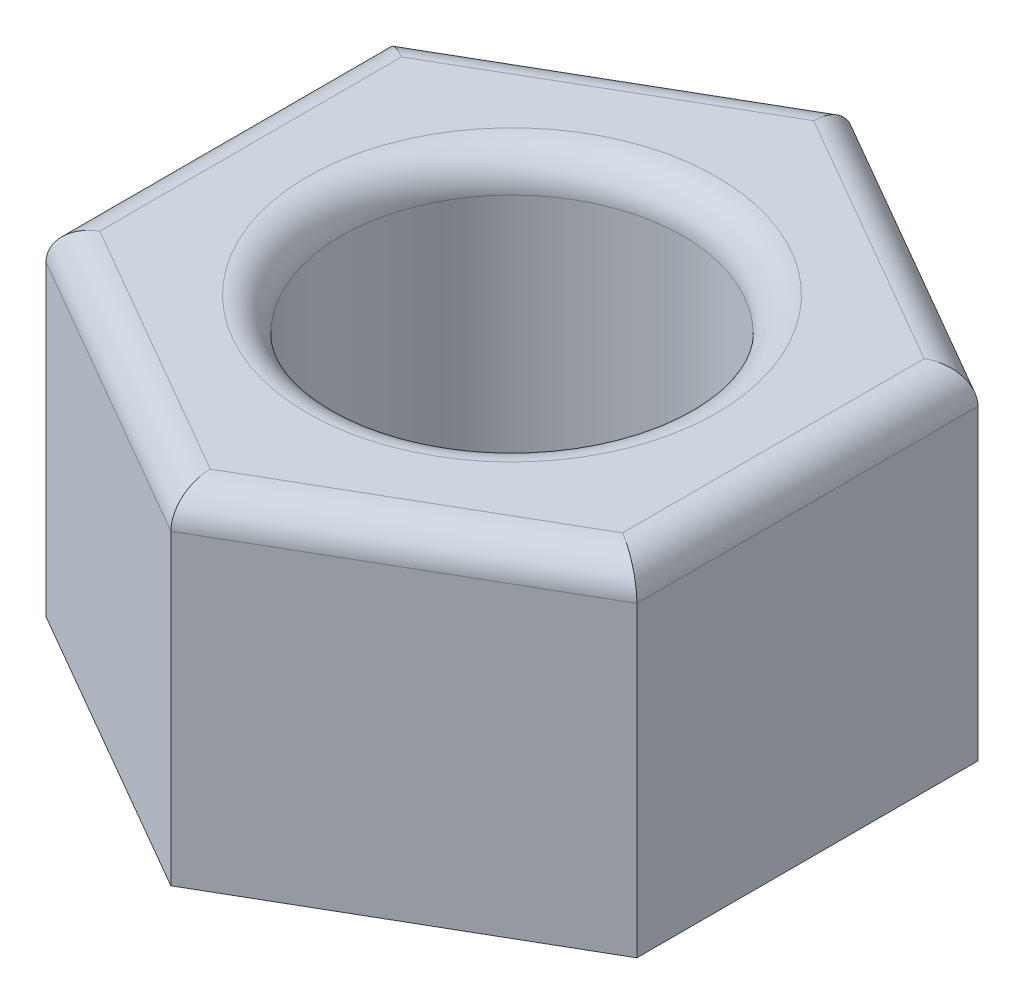
ISO-10303-21;
HEADER;
FILE_DESCRIPTION(('STEP AP214'),'2;1');
FILE_NAME('part.step','',(''),(''),'','','');
FILE_SCHEMA(('AUTOMOTIVE_DESIGN { 1 0 10303 214 1 1 1 1 }'));
ENDSEC;
DATA;
#1=APPLICATION_CONTEXT('core data for automotive mechanical design processes');
#2=APPLICATION_PROTOCOL_DEFINITION('international standard','automotive_design',2000,#1);
#3=PRODUCT_CONTEXT('',#1,'mechanical');
#4=PRODUCT('Part','Part','',(#3));
#5=PRODUCT_RELATED_PRODUCT_CATEGORY('part','',(#4));
#6=PRODUCT_DEFINITION_FORMATION('','',#4);
#7=PRODUCT_DEFINITION_CONTEXT('part definition',#1,'design');
#8=PRODUCT_DEFINITION('design','',#6,#7);
#9=PRODUCT_DEFINITION_SHAPE('','',#8);
#10=(LENGTH_UNIT() NAMED_UNIT(*) SI_UNIT(.MILLI.,.METRE.));
#11=(NAMED_UNIT(*) PLANE_ANGLE_UNIT() SI_UNIT($,.RADIAN.));
#12=(NAMED_UNIT(*) SI_UNIT($,.STERADIAN.) SOLID_ANGLE_UNIT());
#13=UNCERTAINTY_MEASURE_WITH_UNIT(LENGTH_MEASURE(1.E-05),#10,'distance_accuracy_value','');
#14=(GEOMETRIC_REPRESENTATION_CONTEXT(3) GLOBAL_UNCERTAINTY_ASSIGNED_CONTEXT((#13)) GLOBAL_UNIT_ASSIGNED_CONTEXT((#10,
#11,#12)) REPRESENTATION_CONTEXT('',''));
#15=CARTESIAN_POINT('',(0.,0.,0.));
#16=DIRECTION('',(0.,0.,1.));
#17=DIRECTION('',(1.,0.,0.));
#18=AXIS2_PLACEMENT_3D('',#15,#16,#17);
#19=CARTESIAN_POINT('',(0.,5.,0.));
#20=DIRECTION('',(0.,1.,0.));
#21=DIRECTION('',(0.,0.,1.));
#22=AXIS2_PLACEMENT_3D('',#19,#20,#21);
#23=PLANE('',#22);
#24=CARTESIAN_POINT('',(0.,5.,0.));
#25=DIRECTION('',(0.,1.,0.));
#26=DIRECTION('',(0.,0.,1.));
#27=AXIS2_PLACEMENT_3D('',#24,#25,#26);
#28=CIRCLE('',#27,3.);
#29=CARTESIAN_POINT('',(0.,5.,3.));
#30=VERTEX_POINT('',#29);
#31=EDGE_CURVE('E192',#30,#30,#28,.F.);
#32=ORIENTED_EDGE('',*,*,#31,.T.);
#33=EDGE_LOOP('',(#32));
#34=FACE_BOUND('',#33,.T.);
#35=DIRECTION('',(0.866025403784435,0.,-0.500000000000007));
#36=VECTOR('',#35,1.);
#37=CARTESIAN_POINT('',(4.08012701892221,5.,2.06698729810774));
#38=LINE('',#37,#36);
#39=CARTESIAN_POINT('',(0.,5.,4.42264973081037));
#40=VERTEX_POINT('',#39);
#41=CARTESIAN_POINT('',(3.83012701892221,5.,2.21132486540515));
#42=VERTEX_POINT('',#41);
#43=EDGE_CURVE('E185',#40,#42,#38,.T.);
#44=ORIENTED_EDGE('',*,*,#43,.T.);
#45=DIRECTION('',(0.,0.,-1.));
#46=VECTOR('',#45,1.);
#47=CARTESIAN_POINT('',(3.83012701892216,5.,-2.50000000000004));
#48=LINE('',#47,#46);
#49=CARTESIAN_POINT('',(3.83012701892217,5.,-2.21132486540523));
#50=VERTEX_POINT('',#49);
#51=EDGE_CURVE('E188',#42,#50,#48,.T.);
#52=ORIENTED_EDGE('',*,*,#51,.T.);
#53=DIRECTION('',(-0.866025403784442,0.,-0.499999999999995));
#54=VECTOR('',#53,1.);
#55=CARTESIAN_POINT('',(-0.249999999999997,5.,-4.56698729810778));
#56=LINE('',#55,#54);
#57=CARTESIAN_POINT('',(0.,5.,-4.42264973081037));
#58=VERTEX_POINT('',#57);
#59=EDGE_CURVE('E173',#50,#58,#56,.T.);
#60=ORIENTED_EDGE('',*,*,#59,.T.);
#61=DIRECTION('',(-0.866025403784438,0.,0.500000000000001));
#62=VECTOR('',#61,1.);
#63=CARTESIAN_POINT('',(-4.0801270189222,5.,-2.06698729810777));
#64=LINE('',#63,#62);
#65=CARTESIAN_POINT('',(-3.8301270189222,5.,-2.21132486540518));
#66=VERTEX_POINT('',#65);
#67=EDGE_CURVE('E176',#58,#66,#64,.T.);
#68=ORIENTED_EDGE('',*,*,#67,.T.);
#69=DIRECTION('',(0.,0.,1.));
#70=VECTOR('',#69,1.);
#71=CARTESIAN_POINT('',(-3.83012701892218,5.,2.50000000000002));
#72=LINE('',#71,#70);
#73=CARTESIAN_POINT('',(-3.83012701892218,5.,2.2113248654052));
#74=VERTEX_POINT('',#73);
#75=EDGE_CURVE('E179',#66,#74,#72,.T.);
#76=ORIENTED_EDGE('',*,*,#75,.T.);
#77=DIRECTION('',(0.866025403784441,0.,0.499999999999995));
#78=VECTOR('',#77,1.);
#79=CARTESIAN_POINT('',(0.250000000000032,5.,4.56698729810778));
#80=LINE('',#79,#78);
#81=EDGE_CURVE('E182',#74,#40,#80,.T.);
#82=ORIENTED_EDGE('',*,*,#81,.T.);
#83=EDGE_LOOP('',(#44,#52,#60,#68,#76,#82));
#84=FACE_BOUND('',#83,.T.);
#85=ADVANCED_FACE('F39',(#34,#84),#23,.T.);
#86=CARTESIAN_POINT('',(0.,0.,0.));
#87=DIRECTION('',(0.,1.,0.));
#88=DIRECTION('',(0.,0.,1.));
#89=AXIS2_PLACEMENT_3D('',#86,#87,#88);
#90=PLANE('',#89);
#91=DIRECTION('',(-0.866025403784442,0.,-0.499999999999995));
#92=VECTOR('',#91,1.);
#93=CARTESIAN_POINT('',(4.33012701892216,0.,-2.50000000000005));
#94=LINE('',#93,#92);
#95=CARTESIAN_POINT('',(4.33012701892216,0.,-2.50000000000005));
#96=VERTEX_POINT('',#95);
#97=CARTESIAN_POINT('',(0.,0.,-5.));
#98=VERTEX_POINT('',#97);
#99=EDGE_CURVE('E127',#96,#98,#94,.T.);
#100=ORIENTED_EDGE('',*,*,#99,.F.);
#101=DIRECTION('',(0.,0.,-1.));
#102=VECTOR('',#101,1.);
#103=CARTESIAN_POINT('',(4.33012701892222,0.,2.49999999999996));
#104=LINE('',#103,#102);
#105=CARTESIAN_POINT('',(4.33012701892222,0.,2.49999999999996));
#106=VERTEX_POINT('',#105);
#107=EDGE_CURVE('E154',#106,#96,#104,.T.);
#108=ORIENTED_EDGE('',*,*,#107,.F.);
#109=DIRECTION('',(0.866025403784434,0.,-0.500000000000007));
#110=VECTOR('',#109,1.);
#111=CARTESIAN_POINT('',(0.,0.,5.));
#112=LINE('',#111,#110);
#113=CARTESIAN_POINT('',(0.,0.,5.));
#114=VERTEX_POINT('',#113);
#115=EDGE_CURVE('E150',#114,#106,#112,.T.);
#116=ORIENTED_EDGE('',*,*,#115,.F.);
#117=DIRECTION('',(0.866025403784441,0.,0.499999999999995));
#118=VECTOR('',#117,1.);
#119=CARTESIAN_POINT('',(-4.33012701892218,0.,2.50000000000002));
#120=LINE('',#119,#118);
#121=CARTESIAN_POINT('',(-4.33012701892218,0.,2.50000000000002));
#122=VERTEX_POINT('',#121);
#123=EDGE_CURVE('E146',#122,#114,#120,.T.);
#124=ORIENTED_EDGE('',*,*,#123,.F.);
#125=DIRECTION('',(0.,0.,1.));
#126=VECTOR('',#125,1.);
#127=CARTESIAN_POINT('',(-4.3301270189222,0.,-2.49999999999999));
#128=LINE('',#127,#126);
#129=CARTESIAN_POINT('',(-4.3301270189222,0.,-2.49999999999999));
#130=VERTEX_POINT('',#129);
#131=EDGE_CURVE('E130',#130,#122,#128,.T.);
#132=ORIENTED_EDGE('',*,*,#131,.F.);
#133=DIRECTION('',(-0.866025403784438,0.,0.500000000000001));
#134=VECTOR('',#133,1.);
#135=CARTESIAN_POINT('',(0.,0.,-5.));
#136=LINE('',#135,#134);
#137=EDGE_CURVE('E113',#98,#130,#136,.T.);
#138=ORIENTED_EDGE('',*,*,#137,.F.);
#139=EDGE_LOOP('',(#100,#108,#116,#124,#132,#138));
#140=FACE_BOUND('',#139,.T.);
#141=CARTESIAN_POINT('',(0.,0.,0.));
#142=DIRECTION('',(0.,1.,0.));
#143=DIRECTION('',(0.,0.,1.));
#144=AXIS2_PLACEMENT_3D('',#141,#142,#143);
#145=CIRCLE('',#144,2.5);
#146=CARTESIAN_POINT('',(0.,0.,2.5));
#147=VERTEX_POINT('',#146);
#148=EDGE_CURVE('E138',#147,#147,#145,.T.);
#149=ORIENTED_EDGE('',*,*,#148,.T.);
#150=EDGE_LOOP('',(#149));
#151=FACE_BOUND('',#150,.T.);
#152=ADVANCED_FACE('F124',(#140,#151),#90,.F.);
#153=CARTESIAN_POINT('',(4.33012701892216,5.,-2.50000000000005));
#154=DIRECTION('',(-0.499999999999995,0.,0.866025403784442));
#155=DIRECTION('',(0.866025403784442,0.,0.499999999999995));
#156=AXIS2_PLACEMENT_3D('',#153,#154,#155);
#157=PLANE('',#156);
#158=DIRECTION('',(0.,-1.,0.));
#159=VECTOR('',#158,1.);
#160=CARTESIAN_POINT('',(0.,5.,-5.));
#161=LINE('',#160,#159);
#162=CARTESIAN_POINT('',(0.,4.5,-5.));
#163=VERTEX_POINT('',#162);
#164=EDGE_CURVE('E110',#163,#98,#161,.T.);
#165=ORIENTED_EDGE('',*,*,#164,.F.);
#166=DIRECTION('',(-0.866025403784442,0.,-0.499999999999995));
#167=VECTOR('',#166,1.);
#168=CARTESIAN_POINT('',(4.33012701892216,4.5,-2.50000000000005));
#169=LINE('',#168,#167);
#170=CARTESIAN_POINT('',(4.33012701892216,4.5,-2.50000000000005));
#171=VERTEX_POINT('',#170);
#172=EDGE_CURVE('E11',#163,#171,#169,.F.);
#173=ORIENTED_EDGE('',*,*,#172,.T.);
#174=DIRECTION('',(0.,-1.,0.));
#175=VECTOR('',#174,1.);
#176=CARTESIAN_POINT('',(4.33012701892216,5.,-2.50000000000005));
#177=LINE('',#176,#175);
#178=EDGE_CURVE('E135',#171,#96,#177,.T.);
#179=ORIENTED_EDGE('',*,*,#178,.T.);
#180=ORIENTED_EDGE('',*,*,#99,.T.);
#181=EDGE_LOOP('',(#165,#173,#179,#180));
#182=FACE_BOUND('',#181,.T.);
#183=ADVANCED_FACE('F133',(#182),#157,.F.);
#184=CARTESIAN_POINT('',(0.,5.,-5.));
#185=DIRECTION('',(0.500000000000001,0.,0.866025403784438));
#186=DIRECTION('',(0.866025403784438,0.,-0.500000000000001));
#187=AXIS2_PLACEMENT_3D('',#184,#185,#186);
#188=PLANE('',#187);
#189=DIRECTION('',(0.,-1.,0.));
#190=VECTOR('',#189,1.);
#191=CARTESIAN_POINT('',(-4.3301270189222,5.,-2.49999999999999));
#192=LINE('',#191,#190);
#193=CARTESIAN_POINT('',(-4.3301270189222,4.5,-2.49999999999999));
#194=VERTEX_POINT('',#193);
#195=EDGE_CURVE('E120',#194,#130,#192,.T.);
#196=ORIENTED_EDGE('',*,*,#195,.F.);
#197=DIRECTION('',(-0.866025403784438,0.,0.500000000000001));
#198=VECTOR('',#197,1.);
#199=CARTESIAN_POINT('',(0.,4.5,-5.));
#200=LINE('',#199,#198);
#201=EDGE_CURVE('E49',#194,#163,#200,.F.);
#202=ORIENTED_EDGE('',*,*,#201,.T.);
#203=ORIENTED_EDGE('',*,*,#164,.T.);
#204=ORIENTED_EDGE('',*,*,#137,.T.);
#205=EDGE_LOOP('',(#196,#202,#203,#204));
#206=FACE_BOUND('',#205,.T.);
#207=ADVANCED_FACE('F112',(#206),#188,.F.);
#208=CARTESIAN_POINT('',(-4.3301270189222,5.,-2.49999999999999));
#209=DIRECTION('',(1.,0.,0.));
#210=DIRECTION('',(0.,0.,-1.));
#211=AXIS2_PLACEMENT_3D('',#208,#209,#210);
#212=PLANE('',#211);
#213=DIRECTION('',(0.,-1.,0.));
#214=VECTOR('',#213,1.);
#215=CARTESIAN_POINT('',(-4.33012701892218,5.,2.50000000000002));
#216=LINE('',#215,#214);
#217=CARTESIAN_POINT('',(-4.33012701892218,4.5,2.50000000000002));
#218=VERTEX_POINT('',#217);
#219=EDGE_CURVE('E165',#218,#122,#216,.T.);
#220=ORIENTED_EDGE('',*,*,#219,.F.);
#221=DIRECTION('',(0.,0.,1.));
#222=VECTOR('',#221,1.);
#223=CARTESIAN_POINT('',(-4.3301270189222,4.5,-2.49999999999999));
#224=LINE('',#223,#222);
#225=EDGE_CURVE('E64',#218,#194,#224,.F.);
#226=ORIENTED_EDGE('',*,*,#225,.T.);
#227=ORIENTED_EDGE('',*,*,#195,.T.);
#228=ORIENTED_EDGE('',*,*,#131,.T.);
#229=EDGE_LOOP('',(#220,#226,#227,#228));
#230=FACE_BOUND('',#229,.T.);
#231=ADVANCED_FACE('F263',(#230),#212,.F.);
#232=CARTESIAN_POINT('',(-4.33012701892218,5.,2.50000000000002));
#233=DIRECTION('',(0.499999999999995,0.,-0.866025403784441));
#234=DIRECTION('',(-0.866025403784441,0.,-0.499999999999995));
#235=AXIS2_PLACEMENT_3D('',#232,#233,#234);
#236=PLANE('',#235);
#237=DIRECTION('',(0.,-1.,0.));
#238=VECTOR('',#237,1.);
#239=CARTESIAN_POINT('',(0.,5.,5.));
#240=LINE('',#239,#238);
#241=CARTESIAN_POINT('',(0.,4.5,5.));
#242=VERTEX_POINT('',#241);
#243=EDGE_CURVE('E162',#242,#114,#240,.T.);
#244=ORIENTED_EDGE('',*,*,#243,.F.);
#245=DIRECTION('',(0.866025403784441,0.,0.499999999999995));
#246=VECTOR('',#245,1.);
#247=CARTESIAN_POINT('',(-4.33012701892218,4.5,2.50000000000002));
#248=LINE('',#247,#246);
#249=EDGE_CURVE('E203',#242,#218,#248,.F.);
#250=ORIENTED_EDGE('',*,*,#249,.T.);
#251=ORIENTED_EDGE('',*,*,#219,.T.);
#252=ORIENTED_EDGE('',*,*,#123,.T.);
#253=EDGE_LOOP('',(#244,#250,#251,#252));
#254=FACE_BOUND('',#253,.T.);
#255=ADVANCED_FACE('F261',(#254),#236,.F.);
#256=CARTESIAN_POINT('',(0.,5.,5.));
#257=DIRECTION('',(-0.500000000000007,0.,-0.866025403784435));
#258=DIRECTION('',(-0.866025403784435,0.,0.500000000000007));
#259=AXIS2_PLACEMENT_3D('',#256,#257,#258);
#260=PLANE('',#259);
#261=DIRECTION('',(0.,-1.,0.));
#262=VECTOR('',#261,1.);
#263=CARTESIAN_POINT('',(4.33012701892222,5.,2.49999999999996));
#264=LINE('',#263,#262);
#265=CARTESIAN_POINT('',(4.33012701892222,4.5,2.49999999999996));
#266=VERTEX_POINT('',#265);
#267=EDGE_CURVE('E159',#266,#106,#264,.T.);
#268=ORIENTED_EDGE('',*,*,#267,.F.);
#269=DIRECTION('',(0.866025403784435,0.,-0.500000000000007));
#270=VECTOR('',#269,1.);
#271=CARTESIAN_POINT('',(0.,4.5,5.));
#272=LINE('',#271,#270);
#273=EDGE_CURVE('E200',#266,#242,#272,.F.);
#274=ORIENTED_EDGE('',*,*,#273,.T.);
#275=ORIENTED_EDGE('',*,*,#243,.T.);
#276=ORIENTED_EDGE('',*,*,#115,.T.);
#277=EDGE_LOOP('',(#268,#274,#275,#276));
#278=FACE_BOUND('',#277,.T.);
#279=ADVANCED_FACE('F259',(#278),#260,.F.);
#280=CARTESIAN_POINT('',(4.33012701892222,5.,2.49999999999996));
#281=DIRECTION('',(-1.,0.,0.));
#282=DIRECTION('',(0.,0.,1.));
#283=AXIS2_PLACEMENT_3D('',#280,#281,#282);
#284=PLANE('',#283);
#285=ORIENTED_EDGE('',*,*,#178,.F.);
#286=DIRECTION('',(0.,0.,-1.));
#287=VECTOR('',#286,1.);
#288=CARTESIAN_POINT('',(4.33012701892222,4.5,2.49999999999996));
#289=LINE('',#288,#287);
#290=EDGE_CURVE('E196',#171,#266,#289,.F.);
#291=ORIENTED_EDGE('',*,*,#290,.T.);
#292=ORIENTED_EDGE('',*,*,#267,.T.);
#293=ORIENTED_EDGE('',*,*,#107,.T.);
#294=EDGE_LOOP('',(#285,#291,#292,#293));
#295=FACE_BOUND('',#294,.T.);
#296=ADVANCED_FACE('F247',(#295),#284,.F.);
#297=CARTESIAN_POINT('',(0.,5.,0.));
#298=DIRECTION('',(0.,-1.,0.));
#299=DIRECTION('',(0.,0.,-1.));
#300=AXIS2_PLACEMENT_3D('',#297,#298,#299);
#301=CYLINDRICAL_SURFACE('',#300,2.5);
#302=CARTESIAN_POINT('',(0.,4.5,0.));
#303=DIRECTION('',(0.,1.,0.));
#304=DIRECTION('',(0.,0.,1.));
#305=AXIS2_PLACEMENT_3D('',#302,#303,#304);
#306=CIRCLE('',#305,2.5);
#307=CARTESIAN_POINT('',(0.,4.5,2.5));
#308=VERTEX_POINT('',#307);
#309=EDGE_CURVE('E119',#308,#308,#306,.T.);
#310=ORIENTED_EDGE('',*,*,#309,.T.);
#311=EDGE_LOOP('',(#310));
#312=FACE_BOUND('',#311,.T.);
#313=ORIENTED_EDGE('',*,*,#148,.F.);
#314=EDGE_LOOP('',(#313));
#315=FACE_BOUND('',#314,.T.);
#316=ADVANCED_FACE('F281',(#312,#315),#301,.F.);
#317=CARTESIAN_POINT('',(0.,4.5,0.));
#318=DIRECTION('',(0.,1.,0.));
#319=DIRECTION('',(0.,0.,1.));
#320=AXIS2_PLACEMENT_3D('',#317,#318,#319);
#321=TOROIDAL_SURFACE('',#320,3.,0.5);
#322=ORIENTED_EDGE('',*,*,#31,.F.);
#323=EDGE_LOOP('',(#322));
#324=FACE_BOUND('',#323,.T.);
#325=ORIENTED_EDGE('',*,*,#309,.F.);
#326=EDGE_LOOP('',(#325));
#327=FACE_BOUND('',#326,.T.);
#328=ADVANCED_FACE('F300',(#324,#327),#321,.T.);
#329=CARTESIAN_POINT('',(-3.83012701892219,4.5,0.));
#330=DIRECTION('',(0.,0.,-1.));
#331=DIRECTION('',(-1.,0.,0.));
#332=AXIS2_PLACEMENT_3D('',#329,#330,#331);
#333=CYLINDRICAL_SURFACE('',#332,0.5);
#334=CARTESIAN_POINT('',(-3.8301270189222,4.5,-2.21132486540518));
#335=DIRECTION('',(0.499999999999998,0.,-0.86602540378444));
#336=DIRECTION('',(0.86602540378444,0.,0.499999999999998));
#337=AXIS2_PLACEMENT_3D('',#334,#335,#336);
#338=ELLIPSE('',#337,0.577350269189626,0.5);
#339=EDGE_CURVE('E223',#194,#66,#338,.T.);
#340=ORIENTED_EDGE('',*,*,#339,.F.);
#341=ORIENTED_EDGE('',*,*,#225,.F.);
#342=CARTESIAN_POINT('',(-3.83012701892218,4.5,2.2113248654052));
#343=DIRECTION('',(-0.500000000000004,0.,-0.866025403784436));
#344=DIRECTION('',(0.866025403784436,0.,-0.500000000000004));
#345=AXIS2_PLACEMENT_3D('',#342,#343,#344);
#346=ELLIPSE('',#345,0.577350269189626,0.5);
#347=EDGE_CURVE('E43',#74,#218,#346,.F.);
#348=ORIENTED_EDGE('',*,*,#347,.F.);
#349=ORIENTED_EDGE('',*,*,#75,.F.);
#350=EDGE_LOOP('',(#340,#341,#348,#349));
#351=FACE_BOUND('',#350,.T.);
#352=ADVANCED_FACE('F41',(#351),#333,.T.);
#353=CARTESIAN_POINT('',(-1.91506350946108,4.5,3.31698729810779));
#354=DIRECTION('',(-0.866025403784441,0.,-0.499999999999995));
#355=DIRECTION('',(-0.499999999999995,0.,0.866025403784441));
#356=AXIS2_PLACEMENT_3D('',#353,#354,#355);
#357=CYLINDRICAL_SURFACE('',#356,0.5);
#358=ORIENTED_EDGE('',*,*,#347,.T.);
#359=ORIENTED_EDGE('',*,*,#249,.F.);
#360=CARTESIAN_POINT('',(0.,4.5,4.42264973081037));
#361=DIRECTION('',(-1.,0.,0.));
#362=DIRECTION('',(0.,0.,-1.));
#363=AXIS2_PLACEMENT_3D('',#360,#361,#362);
#364=ELLIPSE('',#363,0.577350269189626,0.5);
#365=EDGE_CURVE('E220',#40,#242,#364,.F.);
#366=ORIENTED_EDGE('',*,*,#365,.F.);
#367=ORIENTED_EDGE('',*,*,#81,.F.);
#368=EDGE_LOOP('',(#358,#359,#366,#367));
#369=FACE_BOUND('',#368,.T.);
#370=ADVANCED_FACE('F235',(#369),#357,.T.);
#371=CARTESIAN_POINT('',(-1.9150635094611,4.5,-3.31698729810778));
#372=DIRECTION('',(0.866025403784438,0.,-0.500000000000001));
#373=DIRECTION('',(-0.500000000000001,0.,-0.866025403784438));
#374=AXIS2_PLACEMENT_3D('',#371,#372,#373);
#375=CYLINDRICAL_SURFACE('',#374,0.5);
#376=ORIENTED_EDGE('',*,*,#339,.T.);
#377=ORIENTED_EDGE('',*,*,#67,.F.);
#378=CARTESIAN_POINT('',(0.,4.5,-4.42264973081037));
#379=DIRECTION('',(1.,0.,0.));
#380=DIRECTION('',(0.,0.,1.));
#381=AXIS2_PLACEMENT_3D('',#378,#379,#380);
#382=ELLIPSE('',#381,0.577350269189625,0.5);
#383=EDGE_CURVE('E216',#163,#58,#382,.T.);
#384=ORIENTED_EDGE('',*,*,#383,.F.);
#385=ORIENTED_EDGE('',*,*,#201,.F.);
#386=EDGE_LOOP('',(#376,#377,#384,#385));
#387=FACE_BOUND('',#386,.T.);
#388=ADVANCED_FACE('F239',(#387),#375,.T.);
#389=CARTESIAN_POINT('',(1.91506350946112,4.5,3.31698729810776));
#390=DIRECTION('',(-0.866025403784435,0.,0.500000000000007));
#391=DIRECTION('',(0.500000000000007,0.,0.866025403784435));
#392=AXIS2_PLACEMENT_3D('',#389,#390,#391);
#393=CYLINDRICAL_SURFACE('',#392,0.5);
#394=ORIENTED_EDGE('',*,*,#365,.T.);
#395=ORIENTED_EDGE('',*,*,#273,.F.);
#396=CARTESIAN_POINT('',(3.83012701892221,4.5,2.21132486540515));
#397=DIRECTION('',(-0.499999999999992,0.,0.866025403784443));
#398=DIRECTION('',(-0.866025403784443,0.,-0.499999999999992));
#399=AXIS2_PLACEMENT_3D('',#396,#397,#398);
#400=ELLIPSE('',#399,0.577350269189626,0.5);
#401=EDGE_CURVE('E213',#42,#266,#400,.F.);
#402=ORIENTED_EDGE('',*,*,#401,.F.);
#403=ORIENTED_EDGE('',*,*,#43,.F.);
#404=EDGE_LOOP('',(#394,#395,#402,#403));
#405=FACE_BOUND('',#404,.T.);
#406=ADVANCED_FACE('F256',(#405),#393,.T.);
#407=CARTESIAN_POINT('',(1.91506350946108,4.5,-3.3169872981078));
#408=DIRECTION('',(0.866025403784442,0.,0.499999999999995));
#409=DIRECTION('',(0.499999999999995,0.,-0.866025403784442));
#410=AXIS2_PLACEMENT_3D('',#407,#408,#409);
#411=CYLINDRICAL_SURFACE('',#410,0.5);
#412=ORIENTED_EDGE('',*,*,#383,.T.);
#413=ORIENTED_EDGE('',*,*,#59,.F.);
#414=CARTESIAN_POINT('',(3.83012701892217,4.5,-2.21132486540523));
#415=DIRECTION('',(0.500000000000007,0.,0.866025403784435));
#416=DIRECTION('',(0.866025403784435,0.,-0.500000000000007));
#417=AXIS2_PLACEMENT_3D('',#414,#415,#416);
#418=ELLIPSE('',#417,0.577350269189625,0.5);
#419=EDGE_CURVE('E210',#171,#50,#418,.T.);
#420=ORIENTED_EDGE('',*,*,#419,.F.);
#421=ORIENTED_EDGE('',*,*,#172,.F.);
#422=EDGE_LOOP('',(#412,#413,#420,#421));
#423=FACE_BOUND('',#422,.T.);
#424=ADVANCED_FACE('F244',(#423),#411,.T.);
#425=CARTESIAN_POINT('',(3.83012701892219,4.5,0.));
#426=DIRECTION('',(0.,0.,1.));
#427=DIRECTION('',(1.,0.,0.));
#428=AXIS2_PLACEMENT_3D('',#425,#426,#427);
#429=CYLINDRICAL_SURFACE('',#428,0.5);
#430=ORIENTED_EDGE('',*,*,#401,.T.);
#431=ORIENTED_EDGE('',*,*,#290,.F.);
#432=ORIENTED_EDGE('',*,*,#419,.T.);
#433=ORIENTED_EDGE('',*,*,#51,.F.);
#434=EDGE_LOOP('',(#430,#431,#432,#433));
#435=FACE_BOUND('',#434,.T.);
#436=ADVANCED_FACE('F250',(#435),#429,.T.);
#437=CLOSED_SHELL('',(#85,#152,#183,#207,#231,#255,#279,#296,#316,#328,#352,#370,#388,#406,#424,#436));
#438=MANIFOLD_SOLID_BREP('B2',#437);
#439=ADVANCED_BREP_SHAPE_REPRESENTATION('',(#18,#438),#14);
#440=SHAPE_DEFINITION_REPRESENTATION(#9,#439);
ENDSEC;
END-ISO-10303-21;
